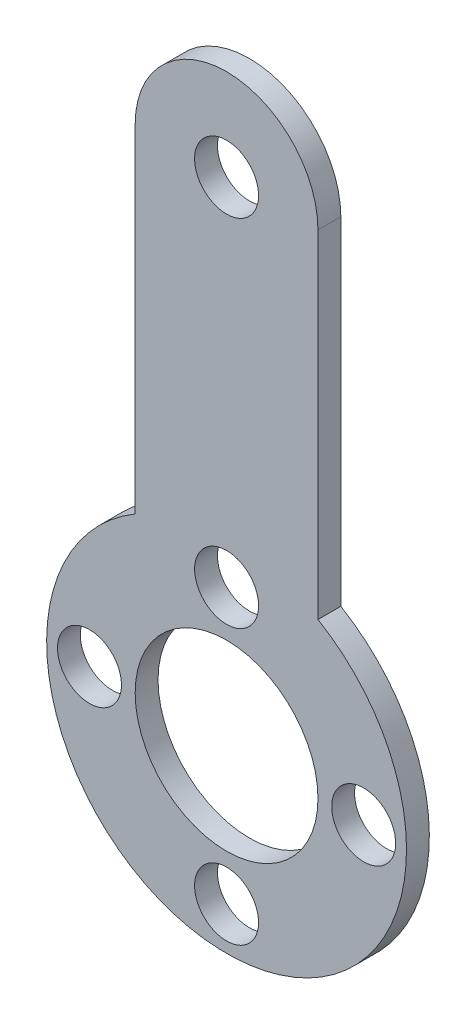
ISO-10303-21;
HEADER;
FILE_DESCRIPTION(('STEP AP214'),'2;1');
FILE_NAME('part.step','',(''),(''),'','','');
FILE_SCHEMA(('AUTOMOTIVE_DESIGN { 1 0 10303 214 1 1 1 1 }'));
ENDSEC;
DATA;
#1=APPLICATION_CONTEXT('core data for automotive mechanical design processes');
#2=APPLICATION_PROTOCOL_DEFINITION('international standard','automotive_design',2000,#1);
#3=PRODUCT_CONTEXT('',#1,'mechanical');
#4=PRODUCT('Part','Part','',(#3));
#5=PRODUCT_RELATED_PRODUCT_CATEGORY('part','',(#4));
#6=PRODUCT_DEFINITION_FORMATION('','',#4);
#7=PRODUCT_DEFINITION_CONTEXT('part definition',#1,'design');
#8=PRODUCT_DEFINITION('design','',#6,#7);
#9=PRODUCT_DEFINITION_SHAPE('','',#8);
#10=(LENGTH_UNIT() NAMED_UNIT(*) SI_UNIT(.MILLI.,.METRE.));
#11=(NAMED_UNIT(*) PLANE_ANGLE_UNIT() SI_UNIT($,.RADIAN.));
#12=(NAMED_UNIT(*) SI_UNIT($,.STERADIAN.) SOLID_ANGLE_UNIT());
#13=UNCERTAINTY_MEASURE_WITH_UNIT(LENGTH_MEASURE(1.E-05),#10,'distance_accuracy_value','');
#14=(GEOMETRIC_REPRESENTATION_CONTEXT(3) GLOBAL_UNCERTAINTY_ASSIGNED_CONTEXT((#13)) GLOBAL_UNIT_ASSIGNED_CONTEXT((#10,
#11,#12)) REPRESENTATION_CONTEXT('',''));
#15=CARTESIAN_POINT('',(0.,0.,0.));
#16=DIRECTION('',(0.,0.,1.));
#17=DIRECTION('',(1.,0.,0.));
#18=AXIS2_PLACEMENT_3D('',#15,#16,#17);
#19=CARTESIAN_POINT('',(0.263552636526776,16.14178478631,1.27));
#20=DIRECTION('',(0.,0.,1.));
#21=DIRECTION('',(1.,0.,0.));
#22=AXIS2_PLACEMENT_3D('',#19,#20,#21);
#23=PLANE('',#22);
#24=CARTESIAN_POINT('',(0.263552636526777,-3.60178478630649,1.27));
#25=DIRECTION('',(0.,0.,1.));
#26=DIRECTION('',(1.,0.,0.));
#27=AXIS2_PLACEMENT_3D('',#24,#25,#26);
#28=CIRCLE('',#27,1.77800000000252);
#29=CARTESIAN_POINT('',(2.0415526365293,-3.60178478630649,1.27));
#30=VERTEX_POINT('',#29);
#31=EDGE_CURVE('E137',#30,#30,#28,.T.);
#32=ORIENTED_EDGE('',*,*,#31,.F.);
#33=EDGE_LOOP('',(#32));
#34=FACE_BOUND('',#33,.T.);
#35=CARTESIAN_POINT('',(0.263552636526777,-18.8417847863136,1.27));
#36=DIRECTION('',(0.,0.,1.));
#37=DIRECTION('',(1.,0.,0.));
#38=AXIS2_PLACEMENT_3D('',#35,#36,#37);
#39=CIRCLE('',#38,1.77800000000462);
#40=CARTESIAN_POINT('',(2.04155263653139,-18.8417847863136,1.27));
#41=VERTEX_POINT('',#40);
#42=EDGE_CURVE('E125',#41,#41,#39,.T.);
#43=ORIENTED_EDGE('',*,*,#42,.F.);
#44=EDGE_LOOP('',(#43));
#45=FACE_BOUND('',#44,.T.);
#46=CARTESIAN_POINT('',(-7.35644736347679,-11.2217847863101,1.27));
#47=DIRECTION('',(0.,0.,1.));
#48=DIRECTION('',(1.,0.,0.));
#49=AXIS2_PLACEMENT_3D('',#46,#47,#48);
#50=CIRCLE('',#49,1.77800000001037);
#51=CARTESIAN_POINT('',(-5.57844736346642,-11.2217847863101,1.27));
#52=VERTEX_POINT('',#51);
#53=EDGE_CURVE('E104',#52,#52,#50,.T.);
#54=ORIENTED_EDGE('',*,*,#53,.F.);
#55=EDGE_LOOP('',(#54));
#56=FACE_BOUND('',#55,.T.);
#57=CARTESIAN_POINT('',(0.263552636526776,16.14178478631,1.27));
#58=DIRECTION('',(0.,0.,1.));
#59=DIRECTION('',(1.,0.,0.));
#60=AXIS2_PLACEMENT_3D('',#57,#58,#59);
#61=CIRCLE('',#60,5.08);
#62=CARTESIAN_POINT('',(5.34355263652678,16.14178478631,1.27));
#63=VERTEX_POINT('',#62);
#64=CARTESIAN_POINT('',(-4.81644736347322,16.14178478631,1.27));
#65=VERTEX_POINT('',#64);
#66=EDGE_CURVE('E89',#63,#65,#61,.T.);
#67=ORIENTED_EDGE('',*,*,#66,.T.);
#68=DIRECTION('',(0.,-1.,0.));
#69=VECTOR('',#68,1.);
#70=CARTESIAN_POINT('',(-4.81644736347322,-2.60821409814602,1.27));
#71=LINE('',#70,#69);
#72=CARTESIAN_POINT('',(-4.81644736347322,-2.60821409814602,1.27));
#73=VERTEX_POINT('',#72);
#74=EDGE_CURVE('E84',#65,#73,#71,.T.);
#75=ORIENTED_EDGE('',*,*,#74,.T.);
#76=CARTESIAN_POINT('',(0.263552636526776,-11.2217847863101,1.27));
#77=DIRECTION('',(0.,0.,1.));
#78=DIRECTION('',(1.,0.,0.));
#79=AXIS2_PLACEMENT_3D('',#76,#77,#78);
#80=CIRCLE('',#79,9.99999999999994);
#81=CARTESIAN_POINT('',(5.34355263652678,-2.60821409814602,1.27));
#82=VERTEX_POINT('',#81);
#83=EDGE_CURVE('E87',#73,#82,#80,.T.);
#84=ORIENTED_EDGE('',*,*,#83,.T.);
#85=DIRECTION('',(0.,1.,0.));
#86=VECTOR('',#85,1.);
#87=CARTESIAN_POINT('',(5.34355263652678,-2.60821409814602,1.27));
#88=LINE('',#87,#86);
#89=EDGE_CURVE('E54',#82,#63,#88,.T.);
#90=ORIENTED_EDGE('',*,*,#89,.T.);
#91=EDGE_LOOP('',(#67,#75,#84,#90));
#92=FACE_BOUND('',#91,.T.);
#93=CARTESIAN_POINT('',(7.88355263653034,-11.2217847863101,1.27));
#94=DIRECTION('',(0.,0.,1.));
#95=DIRECTION('',(1.,0.,0.));
#96=AXIS2_PLACEMENT_3D('',#93,#94,#95);
#97=CIRCLE('',#96,1.77800000000347);
#98=CARTESIAN_POINT('',(9.66155263653382,-11.2217847863101,1.27));
#99=VERTEX_POINT('',#98);
#100=EDGE_CURVE('E119',#99,#99,#97,.T.);
#101=ORIENTED_EDGE('',*,*,#100,.F.);
#102=EDGE_LOOP('',(#101));
#103=FACE_BOUND('',#102,.T.);
#104=CARTESIAN_POINT('',(0.263552636526776,16.14178478631,1.27));
#105=DIRECTION('',(0.,0.,1.));
#106=DIRECTION('',(1.,0.,0.));
#107=AXIS2_PLACEMENT_3D('',#104,#105,#106);
#108=CIRCLE('',#107,1.77800000000357);
#109=CARTESIAN_POINT('',(2.04155263653035,16.14178478631,1.27));
#110=VERTEX_POINT('',#109);
#111=EDGE_CURVE('E131',#110,#110,#108,.T.);
#112=ORIENTED_EDGE('',*,*,#111,.F.);
#113=EDGE_LOOP('',(#112));
#114=FACE_BOUND('',#113,.T.);
#115=CARTESIAN_POINT('',(0.263552636526776,-11.2217847863101,1.27));
#116=DIRECTION('',(0.,0.,1.));
#117=DIRECTION('',(1.,0.,0.));
#118=AXIS2_PLACEMENT_3D('',#115,#116,#117);
#119=CIRCLE('',#118,5.08000000000356);
#120=CARTESIAN_POINT('',(5.34355263653033,-11.2217847863101,1.27));
#121=VERTEX_POINT('',#120);
#122=EDGE_CURVE('E143',#121,#121,#119,.T.);
#123=ORIENTED_EDGE('',*,*,#122,.F.);
#124=EDGE_LOOP('',(#123));
#125=FACE_BOUND('',#124,.T.);
#126=ADVANCED_FACE('F37',(#34,#45,#56,#92,#103,#114,#125),#23,.T.);
#127=CARTESIAN_POINT('',(0.263552636526776,16.14178478631,0.));
#128=DIRECTION('',(0.,0.,1.));
#129=DIRECTION('',(1.,0.,0.));
#130=AXIS2_PLACEMENT_3D('',#127,#128,#129);
#131=PLANE('',#130);
#132=CARTESIAN_POINT('',(0.263552636526776,16.14178478631,0.));
#133=DIRECTION('',(0.,0.,1.));
#134=DIRECTION('',(1.,0.,0.));
#135=AXIS2_PLACEMENT_3D('',#132,#133,#134);
#136=CIRCLE('',#135,5.08);
#137=CARTESIAN_POINT('',(5.34355263652678,16.14178478631,0.));
#138=VERTEX_POINT('',#137);
#139=CARTESIAN_POINT('',(-4.81644736347322,16.14178478631,0.));
#140=VERTEX_POINT('',#139);
#141=EDGE_CURVE('E101',#138,#140,#136,.T.);
#142=ORIENTED_EDGE('',*,*,#141,.F.);
#143=DIRECTION('',(0.,1.,0.));
#144=VECTOR('',#143,1.);
#145=CARTESIAN_POINT('',(5.34355263652678,-2.60821409814602,0.));
#146=LINE('',#145,#144);
#147=CARTESIAN_POINT('',(5.34355263652678,-2.60821409814602,0.));
#148=VERTEX_POINT('',#147);
#149=EDGE_CURVE('E77',#148,#138,#146,.T.);
#150=ORIENTED_EDGE('',*,*,#149,.F.);
#151=CARTESIAN_POINT('',(0.263552636526776,-11.2217847863101,0.));
#152=DIRECTION('',(0.,0.,1.));
#153=DIRECTION('',(1.,0.,0.));
#154=AXIS2_PLACEMENT_3D('',#151,#152,#153);
#155=CIRCLE('',#154,9.99999999999994);
#156=CARTESIAN_POINT('',(-4.81644736347322,-2.60821409814602,0.));
#157=VERTEX_POINT('',#156);
#158=EDGE_CURVE('E71',#157,#148,#155,.T.);
#159=ORIENTED_EDGE('',*,*,#158,.F.);
#160=DIRECTION('',(0.,-1.,0.));
#161=VECTOR('',#160,1.);
#162=CARTESIAN_POINT('',(-4.81644736347322,-2.60821409814602,0.));
#163=LINE('',#162,#161);
#164=EDGE_CURVE('E93',#140,#157,#163,.T.);
#165=ORIENTED_EDGE('',*,*,#164,.F.);
#166=EDGE_LOOP('',(#142,#150,#159,#165));
#167=FACE_BOUND('',#166,.T.);
#168=CARTESIAN_POINT('',(-7.35644736347679,-11.2217847863101,0.));
#169=DIRECTION('',(0.,0.,1.));
#170=DIRECTION('',(1.,0.,0.));
#171=AXIS2_PLACEMENT_3D('',#168,#169,#170);
#172=CIRCLE('',#171,1.77800000001037);
#173=CARTESIAN_POINT('',(-5.57844736346642,-11.2217847863101,0.));
#174=VERTEX_POINT('',#173);
#175=EDGE_CURVE('E116',#174,#174,#172,.T.);
#176=ORIENTED_EDGE('',*,*,#175,.T.);
#177=EDGE_LOOP('',(#176));
#178=FACE_BOUND('',#177,.T.);
#179=CARTESIAN_POINT('',(7.88355263653034,-11.2217847863101,0.));
#180=DIRECTION('',(0.,0.,1.));
#181=DIRECTION('',(1.,0.,0.));
#182=AXIS2_PLACEMENT_3D('',#179,#180,#181);
#183=CIRCLE('',#182,1.77800000000347);
#184=CARTESIAN_POINT('',(9.66155263653382,-11.2217847863101,0.));
#185=VERTEX_POINT('',#184);
#186=EDGE_CURVE('E122',#185,#185,#183,.T.);
#187=ORIENTED_EDGE('',*,*,#186,.T.);
#188=EDGE_LOOP('',(#187));
#189=FACE_BOUND('',#188,.T.);
#190=CARTESIAN_POINT('',(0.263552636526777,-18.8417847863136,0.));
#191=DIRECTION('',(0.,0.,1.));
#192=DIRECTION('',(1.,0.,0.));
#193=AXIS2_PLACEMENT_3D('',#190,#191,#192);
#194=CIRCLE('',#193,1.77800000000462);
#195=CARTESIAN_POINT('',(2.04155263653139,-18.8417847863136,0.));
#196=VERTEX_POINT('',#195);
#197=EDGE_CURVE('E128',#196,#196,#194,.T.);
#198=ORIENTED_EDGE('',*,*,#197,.T.);
#199=EDGE_LOOP('',(#198));
#200=FACE_BOUND('',#199,.T.);
#201=CARTESIAN_POINT('',(0.263552636526776,16.14178478631,0.));
#202=DIRECTION('',(0.,0.,1.));
#203=DIRECTION('',(1.,0.,0.));
#204=AXIS2_PLACEMENT_3D('',#201,#202,#203);
#205=CIRCLE('',#204,1.77800000000357);
#206=CARTESIAN_POINT('',(2.04155263653035,16.14178478631,0.));
#207=VERTEX_POINT('',#206);
#208=EDGE_CURVE('E134',#207,#207,#205,.T.);
#209=ORIENTED_EDGE('',*,*,#208,.T.);
#210=EDGE_LOOP('',(#209));
#211=FACE_BOUND('',#210,.T.);
#212=CARTESIAN_POINT('',(0.263552636526777,-3.60178478630649,0.));
#213=DIRECTION('',(0.,0.,1.));
#214=DIRECTION('',(1.,0.,0.));
#215=AXIS2_PLACEMENT_3D('',#212,#213,#214);
#216=CIRCLE('',#215,1.77800000000252);
#217=CARTESIAN_POINT('',(2.0415526365293,-3.60178478630649,0.));
#218=VERTEX_POINT('',#217);
#219=EDGE_CURVE('E140',#218,#218,#216,.T.);
#220=ORIENTED_EDGE('',*,*,#219,.T.);
#221=EDGE_LOOP('',(#220));
#222=FACE_BOUND('',#221,.T.);
#223=CARTESIAN_POINT('',(0.263552636526776,-11.2217847863101,0.));
#224=DIRECTION('',(0.,0.,1.));
#225=DIRECTION('',(1.,0.,0.));
#226=AXIS2_PLACEMENT_3D('',#223,#224,#225);
#227=CIRCLE('',#226,5.08000000000356);
#228=CARTESIAN_POINT('',(5.34355263653033,-11.2217847863101,0.));
#229=VERTEX_POINT('',#228);
#230=EDGE_CURVE('E146',#229,#229,#227,.T.);
#231=ORIENTED_EDGE('',*,*,#230,.T.);
#232=EDGE_LOOP('',(#231));
#233=FACE_BOUND('',#232,.T.);
#234=ADVANCED_FACE('F112',(#167,#178,#189,#200,#211,#222,#233),#131,.F.);
#235=CARTESIAN_POINT('',(0.263552636526776,16.14178478631,1.27));
#236=DIRECTION('',(0.,0.,-1.));
#237=DIRECTION('',(-1.,0.,0.));
#238=AXIS2_PLACEMENT_3D('',#235,#236,#237);
#239=CYLINDRICAL_SURFACE('',#238,5.08);
#240=ORIENTED_EDGE('',*,*,#141,.T.);
#241=DIRECTION('',(0.,0.,-1.));
#242=VECTOR('',#241,1.);
#243=CARTESIAN_POINT('',(-4.81644736347322,16.14178478631,1.27));
#244=LINE('',#243,#242);
#245=EDGE_CURVE('E11',#65,#140,#244,.T.);
#246=ORIENTED_EDGE('',*,*,#245,.F.);
#247=ORIENTED_EDGE('',*,*,#66,.F.);
#248=DIRECTION('',(0.,0.,-1.));
#249=VECTOR('',#248,1.);
#250=CARTESIAN_POINT('',(5.34355263652678,16.14178478631,1.27));
#251=LINE('',#250,#249);
#252=EDGE_CURVE('E97',#63,#138,#251,.T.);
#253=ORIENTED_EDGE('',*,*,#252,.T.);
#254=EDGE_LOOP('',(#240,#246,#247,#253));
#255=FACE_BOUND('',#254,.T.);
#256=ADVANCED_FACE('F39',(#255),#239,.T.);
#257=CARTESIAN_POINT('',(-4.81644736347322,-2.60821409814602,1.27));
#258=DIRECTION('',(1.,0.,0.));
#259=DIRECTION('',(0.,0.,-1.));
#260=AXIS2_PLACEMENT_3D('',#257,#258,#259);
#261=PLANE('',#260);
#262=ORIENTED_EDGE('',*,*,#164,.T.);
#263=DIRECTION('',(0.,0.,-1.));
#264=VECTOR('',#263,1.);
#265=CARTESIAN_POINT('',(-4.81644736347322,-2.60821409814602,1.27));
#266=LINE('',#265,#264);
#267=EDGE_CURVE('E46',#73,#157,#266,.T.);
#268=ORIENTED_EDGE('',*,*,#267,.F.);
#269=ORIENTED_EDGE('',*,*,#74,.F.);
#270=ORIENTED_EDGE('',*,*,#245,.T.);
#271=EDGE_LOOP('',(#262,#268,#269,#270));
#272=FACE_BOUND('',#271,.T.);
#273=ADVANCED_FACE('F92',(#272),#261,.F.);
#274=CARTESIAN_POINT('',(0.263552636526776,-11.2217847863101,1.27));
#275=DIRECTION('',(0.,0.,-1.));
#276=DIRECTION('',(-1.,0.,0.));
#277=AXIS2_PLACEMENT_3D('',#274,#275,#276);
#278=CYLINDRICAL_SURFACE('',#277,9.99999999999994);
#279=ORIENTED_EDGE('',*,*,#158,.T.);
#280=DIRECTION('',(0.,0.,-1.));
#281=VECTOR('',#280,1.);
#282=CARTESIAN_POINT('',(5.34355263652678,-2.60821409814602,1.27));
#283=LINE('',#282,#281);
#284=EDGE_CURVE('E94',#82,#148,#283,.T.);
#285=ORIENTED_EDGE('',*,*,#284,.F.);
#286=ORIENTED_EDGE('',*,*,#83,.F.);
#287=ORIENTED_EDGE('',*,*,#267,.T.);
#288=EDGE_LOOP('',(#279,#285,#286,#287));
#289=FACE_BOUND('',#288,.T.);
#290=ADVANCED_FACE('F95',(#289),#278,.T.);
#291=CARTESIAN_POINT('',(5.34355263652678,-2.60821409814602,1.27));
#292=DIRECTION('',(-1.,0.,0.));
#293=DIRECTION('',(0.,0.,1.));
#294=AXIS2_PLACEMENT_3D('',#291,#292,#293);
#295=PLANE('',#294);
#296=ORIENTED_EDGE('',*,*,#149,.T.);
#297=ORIENTED_EDGE('',*,*,#252,.F.);
#298=ORIENTED_EDGE('',*,*,#89,.F.);
#299=ORIENTED_EDGE('',*,*,#284,.T.);
#300=EDGE_LOOP('',(#296,#297,#298,#299));
#301=FACE_BOUND('',#300,.T.);
#302=ADVANCED_FACE('F109',(#301),#295,.F.);
#303=CARTESIAN_POINT('',(-7.35644736347679,-11.2217847863101,1.27));
#304=DIRECTION('',(0.,0.,-1.));
#305=DIRECTION('',(-1.,0.,0.));
#306=AXIS2_PLACEMENT_3D('',#303,#304,#305);
#307=CYLINDRICAL_SURFACE('',#306,1.77800000001037);
#308=ORIENTED_EDGE('',*,*,#53,.T.);
#309=EDGE_LOOP('',(#308));
#310=FACE_BOUND('',#309,.T.);
#311=ORIENTED_EDGE('',*,*,#175,.F.);
#312=EDGE_LOOP('',(#311));
#313=FACE_BOUND('',#312,.T.);
#314=ADVANCED_FACE('F165',(#310,#313),#307,.F.);
#315=CARTESIAN_POINT('',(7.88355263653034,-11.2217847863101,1.27));
#316=DIRECTION('',(0.,0.,-1.));
#317=DIRECTION('',(-1.,0.,0.));
#318=AXIS2_PLACEMENT_3D('',#315,#316,#317);
#319=CYLINDRICAL_SURFACE('',#318,1.77800000000347);
#320=ORIENTED_EDGE('',*,*,#100,.T.);
#321=EDGE_LOOP('',(#320));
#322=FACE_BOUND('',#321,.T.);
#323=ORIENTED_EDGE('',*,*,#186,.F.);
#324=EDGE_LOOP('',(#323));
#325=FACE_BOUND('',#324,.T.);
#326=ADVANCED_FACE('F219',(#322,#325),#319,.F.);
#327=CARTESIAN_POINT('',(0.263552636526777,-18.8417847863136,1.27));
#328=DIRECTION('',(0.,0.,-1.));
#329=DIRECTION('',(-1.,0.,0.));
#330=AXIS2_PLACEMENT_3D('',#327,#328,#329);
#331=CYLINDRICAL_SURFACE('',#330,1.77800000000462);
#332=ORIENTED_EDGE('',*,*,#42,.T.);
#333=EDGE_LOOP('',(#332));
#334=FACE_BOUND('',#333,.T.);
#335=ORIENTED_EDGE('',*,*,#197,.F.);
#336=EDGE_LOOP('',(#335));
#337=FACE_BOUND('',#336,.T.);
#338=ADVANCED_FACE('F228',(#334,#337),#331,.F.);
#339=CARTESIAN_POINT('',(0.263552636526776,16.14178478631,1.27));
#340=DIRECTION('',(0.,0.,-1.));
#341=DIRECTION('',(-1.,0.,0.));
#342=AXIS2_PLACEMENT_3D('',#339,#340,#341);
#343=CYLINDRICAL_SURFACE('',#342,1.77800000000357);
#344=ORIENTED_EDGE('',*,*,#111,.T.);
#345=EDGE_LOOP('',(#344));
#346=FACE_BOUND('',#345,.T.);
#347=ORIENTED_EDGE('',*,*,#208,.F.);
#348=EDGE_LOOP('',(#347));
#349=FACE_BOUND('',#348,.T.);
#350=ADVANCED_FACE('F237',(#346,#349),#343,.F.);
#351=CARTESIAN_POINT('',(0.263552636526777,-3.60178478630649,1.27));
#352=DIRECTION('',(0.,0.,-1.));
#353=DIRECTION('',(-1.,0.,0.));
#354=AXIS2_PLACEMENT_3D('',#351,#352,#353);
#355=CYLINDRICAL_SURFACE('',#354,1.77800000000252);
#356=ORIENTED_EDGE('',*,*,#31,.T.);
#357=EDGE_LOOP('',(#356));
#358=FACE_BOUND('',#357,.T.);
#359=ORIENTED_EDGE('',*,*,#219,.F.);
#360=EDGE_LOOP('',(#359));
#361=FACE_BOUND('',#360,.T.);
#362=ADVANCED_FACE('F247',(#358,#361),#355,.F.);
#363=CARTESIAN_POINT('',(0.263552636526776,-11.2217847863101,1.27));
#364=DIRECTION('',(0.,0.,-1.));
#365=DIRECTION('',(-1.,0.,0.));
#366=AXIS2_PLACEMENT_3D('',#363,#364,#365);
#367=CYLINDRICAL_SURFACE('',#366,5.08000000000356);
#368=ORIENTED_EDGE('',*,*,#122,.T.);
#369=EDGE_LOOP('',(#368));
#370=FACE_BOUND('',#369,.T.);
#371=ORIENTED_EDGE('',*,*,#230,.F.);
#372=EDGE_LOOP('',(#371));
#373=FACE_BOUND('',#372,.T.);
#374=ADVANCED_FACE('F152',(#370,#373),#367,.F.);
#375=CLOSED_SHELL('',(#126,#234,#256,#273,#290,#302,#314,#326,#338,#350,#362,#374));
#376=MANIFOLD_SOLID_BREP('B2',#375);
#377=ADVANCED_BREP_SHAPE_REPRESENTATION('',(#18,#376),#14);
#378=SHAPE_DEFINITION_REPRESENTATION(#9,#377);
ENDSEC;
END-ISO-10303-21;
